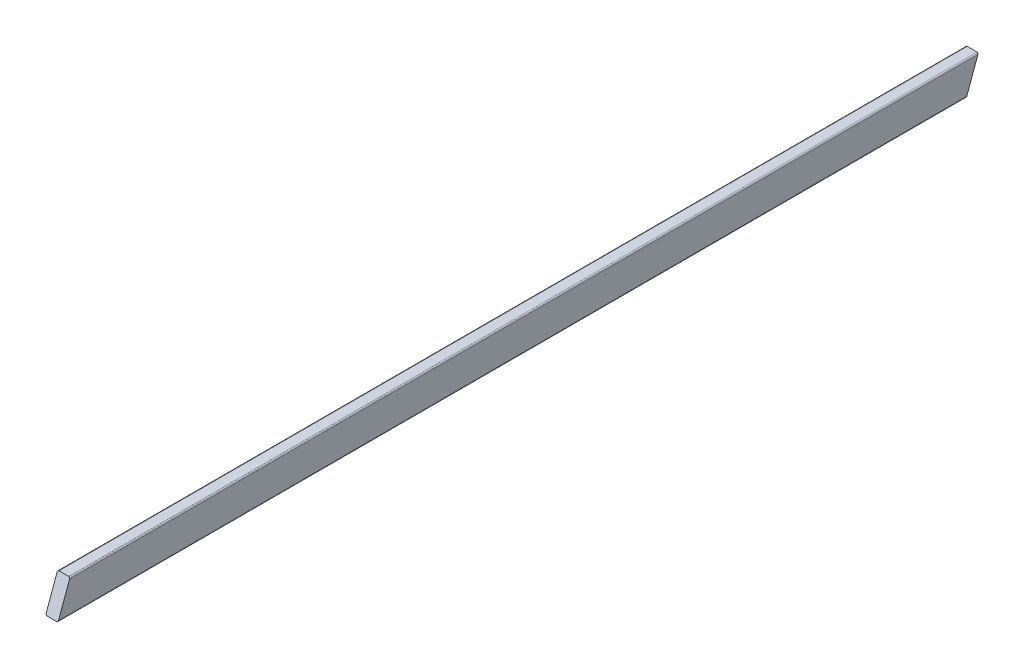
ISO-10303-21;
HEADER;
FILE_DESCRIPTION(('STEP AP214'),'2;1');
FILE_NAME('part.step','',(''),(''),'','','');
FILE_SCHEMA(('AUTOMOTIVE_DESIGN { 1 0 10303 214 1 1 1 1 }'));
ENDSEC;
DATA;
#1=APPLICATION_CONTEXT('core data for automotive mechanical design processes');
#2=APPLICATION_PROTOCOL_DEFINITION('international standard','automotive_design',2000,#1);
#3=PRODUCT_CONTEXT('',#1,'mechanical');
#4=PRODUCT('Part','Part','',(#3));
#5=PRODUCT_RELATED_PRODUCT_CATEGORY('part','',(#4));
#6=PRODUCT_DEFINITION_FORMATION('','',#4);
#7=PRODUCT_DEFINITION_CONTEXT('part definition',#1,'design');
#8=PRODUCT_DEFINITION('design','',#6,#7);
#9=PRODUCT_DEFINITION_SHAPE('','',#8);
#10=(LENGTH_UNIT() NAMED_UNIT(*) SI_UNIT(.MILLI.,.METRE.));
#11=(NAMED_UNIT(*) PLANE_ANGLE_UNIT() SI_UNIT($,.RADIAN.));
#12=(NAMED_UNIT(*) SI_UNIT($,.STERADIAN.) SOLID_ANGLE_UNIT());
#13=UNCERTAINTY_MEASURE_WITH_UNIT(LENGTH_MEASURE(1.E-05),#10,'distance_accuracy_value','');
#14=(GEOMETRIC_REPRESENTATION_CONTEXT(3) GLOBAL_UNCERTAINTY_ASSIGNED_CONTEXT((#13)) GLOBAL_UNIT_ASSIGNED_CONTEXT((#10,
#11,#12)) REPRESENTATION_CONTEXT('',''));
#15=CARTESIAN_POINT('',(0.,0.,0.));
#16=DIRECTION('',(0.,0.,1.));
#17=DIRECTION('',(1.,0.,0.));
#18=AXIS2_PLACEMENT_3D('',#15,#16,#17);
#19=CARTESIAN_POINT('',(4.7625,-12.7,400.));
#20=DIRECTION('',(-1.,0.,0.));
#21=DIRECTION('',(0.,0.,1.));
#22=AXIS2_PLACEMENT_3D('',#19,#20,#21);
#23=PLANE('',#22);
#24=DIRECTION('',(0.,-0.939692620785908,0.34202014332567));
#25=VECTOR('',#24,1.);
#26=CARTESIAN_POINT('',(4.7625,-12.7,353.156605127629));
#27=LINE('',#26,#25);
#28=CARTESIAN_POINT('',(4.7625,11.7,344.275731411534));
#29=VERTEX_POINT('',#28);
#30=CARTESIAN_POINT('',(4.7625,-11.7,352.792634893363));
#31=VERTEX_POINT('',#30);
#32=EDGE_CURVE('E165',#29,#31,#27,.T.);
#33=ORIENTED_EDGE('',*,*,#32,.T.);
#34=DIRECTION('',(0.,0.,-1.));
#35=VECTOR('',#34,1.);
#36=CARTESIAN_POINT('',(4.7625,-11.7,400.));
#37=LINE('',#36,#35);
#38=CARTESIAN_POINT('',(4.7625,-11.7,-344.275731411534));
#39=VERTEX_POINT('',#38);
#40=EDGE_CURVE('E146',#31,#39,#37,.T.);
#41=ORIENTED_EDGE('',*,*,#40,.T.);
#42=DIRECTION('',(0.,0.939692620785908,-0.342020143325669));
#43=VECTOR('',#42,1.);
#44=CARTESIAN_POINT('',(4.7625,-12.7,-343.911761177268));
#45=LINE('',#44,#43);
#46=CARTESIAN_POINT('',(4.7625,11.7,-352.792634893363));
#47=VERTEX_POINT('',#46);
#48=EDGE_CURVE('E163',#39,#47,#45,.T.);
#49=ORIENTED_EDGE('',*,*,#48,.T.);
#50=DIRECTION('',(0.,0.,-1.));
#51=VECTOR('',#50,1.);
#52=CARTESIAN_POINT('',(4.7625,11.7,400.));
#53=LINE('',#52,#51);
#54=EDGE_CURVE('E109',#47,#29,#53,.F.);
#55=ORIENTED_EDGE('',*,*,#54,.T.);
#56=EDGE_LOOP('',(#33,#41,#49,#55));
#57=FACE_BOUND('',#56,.T.);
#58=ADVANCED_FACE('F34',(#57),#23,.F.);
#59=CARTESIAN_POINT('',(-4.7625,12.7,400.));
#60=DIRECTION('',(0.,-1.,0.));
#61=DIRECTION('',(0.,0.,-1.));
#62=AXIS2_PLACEMENT_3D('',#59,#60,#61);
#63=PLANE('',#62);
#64=DIRECTION('',(1.,0.,0.));
#65=VECTOR('',#64,1.);
#66=CARTESIAN_POINT('',(-4.7625,12.7000000000001,-353.156605127629));
#67=LINE('',#66,#65);
#68=CARTESIAN_POINT('',(-3.7625,12.7000000000001,-353.156605127629));
#69=VERTEX_POINT('',#68);
#70=CARTESIAN_POINT('',(3.7625,12.7000000000001,-353.156605127629));
#71=VERTEX_POINT('',#70);
#72=EDGE_CURVE('E152',#69,#71,#67,.T.);
#73=ORIENTED_EDGE('',*,*,#72,.F.);
#74=DIRECTION('',(0.,0.,-1.));
#75=VECTOR('',#74,1.);
#76=CARTESIAN_POINT('',(-3.7625,12.7,400.));
#77=LINE('',#76,#75);
#78=CARTESIAN_POINT('',(-3.7625,12.7,343.911761177268));
#79=VERTEX_POINT('',#78);
#80=EDGE_CURVE('E12',#69,#79,#77,.F.);
#81=ORIENTED_EDGE('',*,*,#80,.T.);
#82=DIRECTION('',(1.,0.,0.));
#83=VECTOR('',#82,1.);
#84=CARTESIAN_POINT('',(-4.7625,12.7,343.911761177268));
#85=LINE('',#84,#83);
#86=CARTESIAN_POINT('',(3.7625,12.7,343.911761177268));
#87=VERTEX_POINT('',#86);
#88=EDGE_CURVE('E129',#79,#87,#85,.T.);
#89=ORIENTED_EDGE('',*,*,#88,.T.);
#90=DIRECTION('',(0.,0.,-1.));
#91=VECTOR('',#90,1.);
#92=CARTESIAN_POINT('',(3.7625,12.7,400.));
#93=LINE('',#92,#91);
#94=EDGE_CURVE('E42',#87,#71,#93,.T.);
#95=ORIENTED_EDGE('',*,*,#94,.T.);
#96=EDGE_LOOP('',(#73,#81,#89,#95));
#97=FACE_BOUND('',#96,.T.);
#98=ADVANCED_FACE('F151',(#97),#63,.F.);
#99=CARTESIAN_POINT('',(-4.7625,-12.7,400.));
#100=DIRECTION('',(1.,0.,0.));
#101=DIRECTION('',(0.,0.,-1.));
#102=AXIS2_PLACEMENT_3D('',#99,#100,#101);
#103=PLANE('',#102);
#104=DIRECTION('',(0.,0.939692620785908,-0.342020143325669));
#105=VECTOR('',#104,1.);
#106=CARTESIAN_POINT('',(-4.7625,-12.7,-343.911761177268));
#107=LINE('',#106,#105);
#108=CARTESIAN_POINT('',(-4.7625,-11.7,-344.275731411534));
#109=VERTEX_POINT('',#108);
#110=CARTESIAN_POINT('',(-4.7625,11.7,-352.792634893363));
#111=VERTEX_POINT('',#110);
#112=EDGE_CURVE('E121',#109,#111,#107,.T.);
#113=ORIENTED_EDGE('',*,*,#112,.F.);
#114=DIRECTION('',(0.,0.,-1.));
#115=VECTOR('',#114,1.);
#116=CARTESIAN_POINT('',(-4.7625,-11.7,400.));
#117=LINE('',#116,#115);
#118=CARTESIAN_POINT('',(-4.7625,-11.7,352.792634893363));
#119=VERTEX_POINT('',#118);
#120=EDGE_CURVE('E139',#109,#119,#117,.F.);
#121=ORIENTED_EDGE('',*,*,#120,.T.);
#122=DIRECTION('',(0.,-0.939692620785908,0.34202014332567));
#123=VECTOR('',#122,1.);
#124=CARTESIAN_POINT('',(-4.7625,-12.7,353.156605127629));
#125=LINE('',#124,#123);
#126=CARTESIAN_POINT('',(-4.7625,11.7,344.275731411534));
#127=VERTEX_POINT('',#126);
#128=EDGE_CURVE('E105',#127,#119,#125,.T.);
#129=ORIENTED_EDGE('',*,*,#128,.F.);
#130=DIRECTION('',(0.,0.,-1.));
#131=VECTOR('',#130,1.);
#132=CARTESIAN_POINT('',(-4.7625,11.7,400.));
#133=LINE('',#132,#131);
#134=EDGE_CURVE('E136',#127,#111,#133,.T.);
#135=ORIENTED_EDGE('',*,*,#134,.T.);
#136=EDGE_LOOP('',(#113,#121,#129,#135));
#137=FACE_BOUND('',#136,.T.);
#138=ADVANCED_FACE('F171',(#137),#103,.F.);
#139=CARTESIAN_POINT('',(-4.7625,-12.7,400.));
#140=DIRECTION('',(0.,1.,0.));
#141=DIRECTION('',(0.,0.,1.));
#142=AXIS2_PLACEMENT_3D('',#139,#140,#141);
#143=PLANE('',#142);
#144=DIRECTION('',(1.,0.,0.));
#145=VECTOR('',#144,1.);
#146=CARTESIAN_POINT('',(-4.7625,-12.7,353.156605127629));
#147=LINE('',#146,#145);
#148=CARTESIAN_POINT('',(-3.7625,-12.7,353.156605127629));
#149=VERTEX_POINT('',#148);
#150=CARTESIAN_POINT('',(3.7625,-12.7,353.156605127629));
#151=VERTEX_POINT('',#150);
#152=EDGE_CURVE('E102',#149,#151,#147,.T.);
#153=ORIENTED_EDGE('',*,*,#152,.F.);
#154=DIRECTION('',(0.,0.,-1.));
#155=VECTOR('',#154,1.);
#156=CARTESIAN_POINT('',(-3.7625,-12.7,400.));
#157=LINE('',#156,#155);
#158=CARTESIAN_POINT('',(-3.7625,-12.7,-343.911761177268));
#159=VERTEX_POINT('',#158);
#160=EDGE_CURVE('E116',#149,#159,#157,.T.);
#161=ORIENTED_EDGE('',*,*,#160,.T.);
#162=DIRECTION('',(1.,0.,0.));
#163=VECTOR('',#162,1.);
#164=CARTESIAN_POINT('',(-4.7625,-12.7,-343.911761177268));
#165=LINE('',#164,#163);
#166=CARTESIAN_POINT('',(3.7625,-12.7,-343.911761177268));
#167=VERTEX_POINT('',#166);
#168=EDGE_CURVE('E120',#159,#167,#165,.T.);
#169=ORIENTED_EDGE('',*,*,#168,.T.);
#170=DIRECTION('',(0.,0.,-1.));
#171=VECTOR('',#170,1.);
#172=CARTESIAN_POINT('',(3.7625,-12.7,400.));
#173=LINE('',#172,#171);
#174=EDGE_CURVE('E119',#167,#151,#173,.F.);
#175=ORIENTED_EDGE('',*,*,#174,.T.);
#176=EDGE_LOOP('',(#153,#161,#169,#175));
#177=FACE_BOUND('',#176,.T.);
#178=ADVANCED_FACE('F114',(#177),#143,.F.);
#179=CARTESIAN_POINT('',(-4.7625,-12.7,-343.911761177268));
#180=DIRECTION('',(0.,-0.342020143325669,-0.939692620785908));
#181=DIRECTION('',(0.,0.939692620785908,-0.342020143325669));
#182=AXIS2_PLACEMENT_3D('',#179,#180,#181);
#183=PLANE('',#182);
#184=ORIENTED_EDGE('',*,*,#168,.F.);
#185=CARTESIAN_POINT('',(-3.7625,-11.7,-344.275731411534));
#186=DIRECTION('',(0.,-0.342020143325669,-0.939692620785908));
#187=DIRECTION('',(0.,0.939692620785908,-0.342020143325669));
#188=AXIS2_PLACEMENT_3D('',#185,#186,#187);
#189=ELLIPSE('',#188,1.06417777247591,1.);
#190=EDGE_CURVE('E124',#159,#109,#189,.T.);
#191=ORIENTED_EDGE('',*,*,#190,.T.);
#192=ORIENTED_EDGE('',*,*,#112,.T.);
#193=CARTESIAN_POINT('',(-3.7625,11.7,-352.792634893363));
#194=DIRECTION('',(0.,-0.342020143325669,-0.939692620785908));
#195=DIRECTION('',(0.,0.939692620785908,-0.342020143325669));
#196=AXIS2_PLACEMENT_3D('',#193,#194,#195);
#197=ELLIPSE('',#196,1.06417777247591,1.);
#198=EDGE_CURVE('E127',#111,#69,#197,.T.);
#199=ORIENTED_EDGE('',*,*,#198,.T.);
#200=ORIENTED_EDGE('',*,*,#72,.T.);
#201=CARTESIAN_POINT('',(3.7625,11.7,-352.792634893363));
#202=DIRECTION('',(0.,-0.342020143325669,-0.939692620785908));
#203=DIRECTION('',(0.,0.939692620785908,-0.342020143325669));
#204=AXIS2_PLACEMENT_3D('',#201,#202,#203);
#205=ELLIPSE('',#204,1.06417777247591,1.);
#206=EDGE_CURVE('E125',#71,#47,#205,.T.);
#207=ORIENTED_EDGE('',*,*,#206,.T.);
#208=ORIENTED_EDGE('',*,*,#48,.F.);
#209=CARTESIAN_POINT('',(3.7625,-11.7,-344.275731411534));
#210=DIRECTION('',(0.,-0.342020143325669,-0.939692620785908));
#211=DIRECTION('',(0.,0.939692620785908,-0.342020143325669));
#212=AXIS2_PLACEMENT_3D('',#209,#210,#211);
#213=ELLIPSE('',#212,1.06417777247591,1.);
#214=EDGE_CURVE('E133',#39,#167,#213,.T.);
#215=ORIENTED_EDGE('',*,*,#214,.T.);
#216=EDGE_LOOP('',(#184,#191,#192,#199,#200,#207,#208,#215));
#217=FACE_BOUND('',#216,.T.);
#218=ADVANCED_FACE('F155',(#217),#183,.T.);
#219=CARTESIAN_POINT('',(-4.7625,-12.7,353.156605127629));
#220=DIRECTION('',(0.,0.34202014332567,0.939692620785908));
#221=DIRECTION('',(0.,-0.939692620785908,0.34202014332567));
#222=AXIS2_PLACEMENT_3D('',#219,#220,#221);
#223=PLANE('',#222);
#224=ORIENTED_EDGE('',*,*,#128,.T.);
#225=CARTESIAN_POINT('',(-3.7625,-11.7,352.792634893363));
#226=DIRECTION('',(0.,0.34202014332567,0.939692620785908));
#227=DIRECTION('',(0.,0.939692620785908,-0.34202014332567));
#228=AXIS2_PLACEMENT_3D('',#225,#226,#227);
#229=ELLIPSE('',#228,1.06417777247591,1.);
#230=EDGE_CURVE('E99',#119,#149,#229,.T.);
#231=ORIENTED_EDGE('',*,*,#230,.T.);
#232=ORIENTED_EDGE('',*,*,#152,.T.);
#233=CARTESIAN_POINT('',(3.7625,-11.7,352.792634893363));
#234=DIRECTION('',(0.,0.34202014332567,0.939692620785908));
#235=DIRECTION('',(0.,0.939692620785908,-0.34202014332567));
#236=AXIS2_PLACEMENT_3D('',#233,#234,#235);
#237=ELLIPSE('',#236,1.06417777247591,1.);
#238=EDGE_CURVE('E110',#151,#31,#237,.T.);
#239=ORIENTED_EDGE('',*,*,#238,.T.);
#240=ORIENTED_EDGE('',*,*,#32,.F.);
#241=CARTESIAN_POINT('',(3.7625,11.7,344.275731411534));
#242=DIRECTION('',(0.,0.34202014332567,0.939692620785908));
#243=DIRECTION('',(0.,0.939692620785908,-0.34202014332567));
#244=AXIS2_PLACEMENT_3D('',#241,#242,#243);
#245=ELLIPSE('',#244,1.06417777247591,1.);
#246=EDGE_CURVE('E49',#29,#87,#245,.T.);
#247=ORIENTED_EDGE('',*,*,#246,.T.);
#248=ORIENTED_EDGE('',*,*,#88,.F.);
#249=CARTESIAN_POINT('',(-3.7625,11.7,344.275731411534));
#250=DIRECTION('',(0.,0.34202014332567,0.939692620785908));
#251=DIRECTION('',(0.,0.939692620785908,-0.34202014332567));
#252=AXIS2_PLACEMENT_3D('',#249,#250,#251);
#253=ELLIPSE('',#252,1.06417777247591,1.);
#254=EDGE_CURVE('E142',#79,#127,#253,.T.);
#255=ORIENTED_EDGE('',*,*,#254,.T.);
#256=EDGE_LOOP('',(#224,#231,#232,#239,#240,#247,#248,#255));
#257=FACE_BOUND('',#256,.T.);
#258=ADVANCED_FACE('F101',(#257),#223,.T.);
#259=CARTESIAN_POINT('',(-3.7625,-11.7,400.));
#260=DIRECTION('',(0.,0.,-1.));
#261=DIRECTION('',(-1.,0.,0.));
#262=AXIS2_PLACEMENT_3D('',#259,#260,#261);
#263=CYLINDRICAL_SURFACE('',#262,1.);
#264=ORIENTED_EDGE('',*,*,#230,.F.);
#265=ORIENTED_EDGE('',*,*,#120,.F.);
#266=ORIENTED_EDGE('',*,*,#190,.F.);
#267=ORIENTED_EDGE('',*,*,#160,.F.);
#268=EDGE_LOOP('',(#264,#265,#266,#267));
#269=FACE_BOUND('',#268,.T.);
#270=ADVANCED_FACE('F123',(#269),#263,.T.);
#271=CARTESIAN_POINT('',(3.7625,-11.7,400.));
#272=DIRECTION('',(0.,0.,-1.));
#273=DIRECTION('',(-1.,0.,0.));
#274=AXIS2_PLACEMENT_3D('',#271,#272,#273);
#275=CYLINDRICAL_SURFACE('',#274,1.);
#276=ORIENTED_EDGE('',*,*,#238,.F.);
#277=ORIENTED_EDGE('',*,*,#174,.F.);
#278=ORIENTED_EDGE('',*,*,#214,.F.);
#279=ORIENTED_EDGE('',*,*,#40,.F.);
#280=EDGE_LOOP('',(#276,#277,#278,#279));
#281=FACE_BOUND('',#280,.T.);
#282=ADVANCED_FACE('F177',(#281),#275,.T.);
#283=CARTESIAN_POINT('',(-3.7625,11.7,400.));
#284=DIRECTION('',(0.,0.,-1.));
#285=DIRECTION('',(-1.,0.,0.));
#286=AXIS2_PLACEMENT_3D('',#283,#284,#285);
#287=CYLINDRICAL_SURFACE('',#286,1.);
#288=ORIENTED_EDGE('',*,*,#254,.F.);
#289=ORIENTED_EDGE('',*,*,#80,.F.);
#290=ORIENTED_EDGE('',*,*,#198,.F.);
#291=ORIENTED_EDGE('',*,*,#134,.F.);
#292=EDGE_LOOP('',(#288,#289,#290,#291));
#293=FACE_BOUND('',#292,.T.);
#294=ADVANCED_FACE('F175',(#293),#287,.T.);
#295=CARTESIAN_POINT('',(3.7625,11.7,400.));
#296=DIRECTION('',(0.,0.,-1.));
#297=DIRECTION('',(-1.,0.,0.));
#298=AXIS2_PLACEMENT_3D('',#295,#296,#297);
#299=CYLINDRICAL_SURFACE('',#298,1.);
#300=ORIENTED_EDGE('',*,*,#246,.F.);
#301=ORIENTED_EDGE('',*,*,#54,.F.);
#302=ORIENTED_EDGE('',*,*,#206,.F.);
#303=ORIENTED_EDGE('',*,*,#94,.F.);
#304=EDGE_LOOP('',(#300,#301,#302,#303));
#305=FACE_BOUND('',#304,.T.);
#306=ADVANCED_FACE('F36',(#305),#299,.T.);
#307=CLOSED_SHELL('',(#58,#98,#138,#178,#218,#258,#270,#282,#294,#306));
#308=MANIFOLD_SOLID_BREP('B2',#307);
#309=ADVANCED_BREP_SHAPE_REPRESENTATION('',(#18,#308),#14);
#310=SHAPE_DEFINITION_REPRESENTATION(#9,#309);
ENDSEC;
END-ISO-10303-21;
